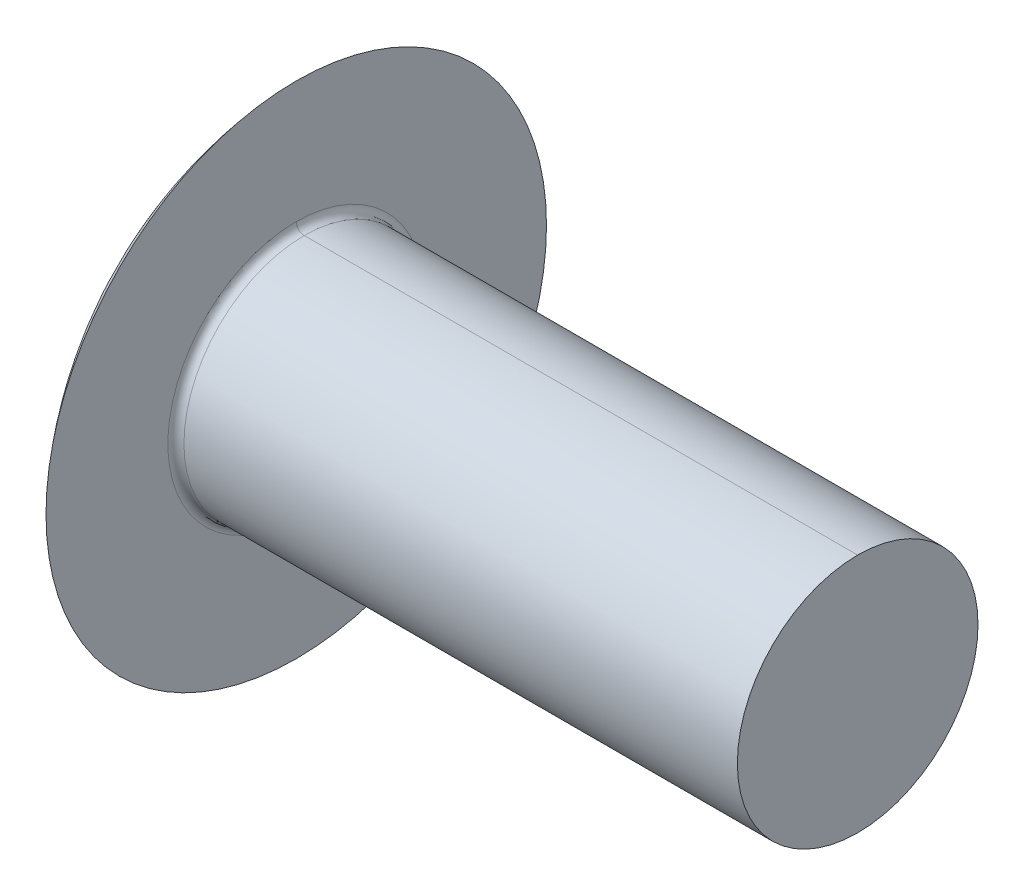
ISO-10303-21;
HEADER;
FILE_DESCRIPTION(('STEP AP214'),'2;1');
FILE_NAME('part.step','',(''),(''),'','','');
FILE_SCHEMA(('AUTOMOTIVE_DESIGN { 1 0 10303 214 1 1 1 1 }'));
ENDSEC;
DATA;
#1=APPLICATION_CONTEXT('core data for automotive mechanical design processes');
#2=APPLICATION_PROTOCOL_DEFINITION('international standard','automotive_design',2000,#1);
#3=PRODUCT_CONTEXT('',#1,'mechanical');
#4=PRODUCT('Part','Part','',(#3));
#5=PRODUCT_RELATED_PRODUCT_CATEGORY('part','',(#4));
#6=PRODUCT_DEFINITION_FORMATION('','',#4);
#7=PRODUCT_DEFINITION_CONTEXT('part definition',#1,'design');
#8=PRODUCT_DEFINITION('design','',#6,#7);
#9=PRODUCT_DEFINITION_SHAPE('','',#8);
#10=(LENGTH_UNIT() NAMED_UNIT(*) SI_UNIT(.MILLI.,.METRE.));
#11=(NAMED_UNIT(*) PLANE_ANGLE_UNIT() SI_UNIT($,.RADIAN.));
#12=(NAMED_UNIT(*) SI_UNIT($,.STERADIAN.) SOLID_ANGLE_UNIT());
#13=UNCERTAINTY_MEASURE_WITH_UNIT(LENGTH_MEASURE(1.E-05),#10,'distance_accuracy_value','');
#14=(GEOMETRIC_REPRESENTATION_CONTEXT(3) GLOBAL_UNCERTAINTY_ASSIGNED_CONTEXT((#13)) GLOBAL_UNIT_ASSIGNED_CONTEXT((#10,
#11,#12)) REPRESENTATION_CONTEXT('',''));
#15=CARTESIAN_POINT('',(0.,0.,0.));
#16=DIRECTION('',(0.,0.,1.));
#17=DIRECTION('',(1.,0.,0.));
#18=AXIS2_PLACEMENT_3D('',#15,#16,#17);
#19=CARTESIAN_POINT('',(0.,0.,0.));
#20=DIRECTION('',(-1.,0.,0.));
#21=DIRECTION('',(0.,-1.,0.));
#22=AXIS2_PLACEMENT_3D('',#19,#20,#21);
#23=CYLINDRICAL_SURFACE('',#22,1.5);
#24=DIRECTION('',(-1.,0.,0.));
#25=VECTOR('',#24,1.);
#26=CARTESIAN_POINT('',(0.,1.5,0.));
#27=LINE('',#26,#25);
#28=CARTESIAN_POINT('',(8.2,1.5,0.));
#29=VERTEX_POINT('',#28);
#30=CARTESIAN_POINT('',(1.3,1.5,0.));
#31=VERTEX_POINT('',#30);
#32=EDGE_CURVE('E85',#29,#31,#27,.T.);
#33=ORIENTED_EDGE('',*,*,#32,.F.);
#34=CARTESIAN_POINT('',(8.2,0.,0.));
#35=DIRECTION('',(-1.,0.,0.));
#36=DIRECTION('',(0.,-1.,0.));
#37=AXIS2_PLACEMENT_3D('',#34,#35,#36);
#38=CIRCLE('',#37,1.5);
#39=CARTESIAN_POINT('',(8.2,-1.5,0.));
#40=VERTEX_POINT('',#39);
#41=EDGE_CURVE('E10',#29,#40,#38,.T.);
#42=ORIENTED_EDGE('',*,*,#41,.T.);
#43=DIRECTION('',(-1.,0.,0.));
#44=VECTOR('',#43,1.);
#45=CARTESIAN_POINT('',(0.,-1.5,0.));
#46=LINE('',#45,#44);
#47=CARTESIAN_POINT('',(1.3,-1.5,0.));
#48=VERTEX_POINT('',#47);
#49=EDGE_CURVE('E82',#40,#48,#46,.T.);
#50=ORIENTED_EDGE('',*,*,#49,.T.);
#51=CARTESIAN_POINT('',(1.3,0.,0.));
#52=DIRECTION('',(-1.,0.,0.));
#53=DIRECTION('',(0.,-1.,0.));
#54=AXIS2_PLACEMENT_3D('',#51,#52,#53);
#55=CIRCLE('',#54,1.5);
#56=EDGE_CURVE('E67',#31,#48,#55,.T.);
#57=ORIENTED_EDGE('',*,*,#56,.F.);
#58=EDGE_LOOP('',(#33,#42,#50,#57));
#59=FACE_BOUND('',#58,.T.);
#60=ADVANCED_FACE('F15',(#59),#23,.T.);
#61=CARTESIAN_POINT('',(8.2,1.5,0.));
#62=DIRECTION('',(-1.,0.,0.));
#63=DIRECTION('',(0.,0.,1.));
#64=AXIS2_PLACEMENT_3D('',#61,#62,#63);
#65=PLANE('',#64);
#66=CARTESIAN_POINT('',(8.2,0.,0.));
#67=DIRECTION('',(-1.,0.,0.));
#68=DIRECTION('',(0.,-1.,0.));
#69=AXIS2_PLACEMENT_3D('',#66,#67,#68);
#70=CIRCLE('',#69,1.5);
#71=EDGE_CURVE('E91',#40,#29,#70,.T.);
#72=ORIENTED_EDGE('',*,*,#71,.F.);
#73=ORIENTED_EDGE('',*,*,#41,.F.);
#74=EDGE_LOOP('',(#72,#73));
#75=FACE_BOUND('',#74,.T.);
#76=ADVANCED_FACE('F17',(#75),#65,.F.);
#77=CARTESIAN_POINT('',(4.99826676265366,-0.1316410625591,0.));
#78=DIRECTION('',(0.,0.,1.));
#79=DIRECTION('',(0.,1.,0.));
#80=AXIS2_PLACEMENT_3D('',#77,#78,#79);
#81=CIRCLE('',#80,5.);
#82=TRIMMED_CURVE('',#81,(PARAMETER_VALUE(-1.54446507165844)),
(PARAMETER_VALUE(1.54446507165844)),.T.,.PARAMETER.);
#83=CARTESIAN_POINT('',(4.99826676265366,0.,0.));
#84=DIRECTION('',(-1.,0.,0.));
#85=AXIS1_PLACEMENT('',#83,#84);
#86=SURFACE_OF_REVOLUTION('',#82,#85);
#87=CARTESIAN_POINT('',(4.99826676265366,-0.1316410625591,0.));
#88=DIRECTION('',(0.,0.,1.));
#89=DIRECTION('',(0.,-1.,0.));
#90=AXIS2_PLACEMENT_3D('',#87,#88,#89);
#91=CIRCLE('',#90,5.);
#92=CARTESIAN_POINT('',(1.2,3.12,0.));
#93=VERTEX_POINT('',#92);
#94=CARTESIAN_POINT('',(0.,0.,0.));
#95=VERTEX_POINT('',#94);
#96=EDGE_CURVE('E19',#93,#95,#91,.T.);
#97=ORIENTED_EDGE('',*,*,#96,.F.);
#98=CARTESIAN_POINT('',(1.2,0.,0.));
#99=DIRECTION('',(-1.,0.,0.));
#100=DIRECTION('',(0.,-1.,0.));
#101=AXIS2_PLACEMENT_3D('',#98,#99,#100);
#102=CIRCLE('',#101,3.12);
#103=CARTESIAN_POINT('',(1.2,-3.12,0.));
#104=VERTEX_POINT('',#103);
#105=EDGE_CURVE('E26',#93,#104,#102,.T.);
#106=ORIENTED_EDGE('',*,*,#105,.T.);
#107=CARTESIAN_POINT('',(4.99826676265366,0.1316410625591,0.));
#108=DIRECTION('',(0.,0.,-1.));
#109=DIRECTION('',(-1.,0.,0.));
#110=AXIS2_PLACEMENT_3D('',#107,#108,#109);
#111=CIRCLE('',#110,5.);
#112=EDGE_CURVE('E123',#104,#95,#111,.T.);
#113=ORIENTED_EDGE('',*,*,#112,.T.);
#114=EDGE_LOOP('',(#97,#106,#113));
#115=FACE_BOUND('',#114,.T.);
#116=ADVANCED_FACE('F135',(#115),#86,.T.);
#117=CARTESIAN_POINT('',(1.2,3.12,0.));
#118=DIRECTION('',(-1.,0.,0.));
#119=DIRECTION('',(0.,0.,1.));
#120=AXIS2_PLACEMENT_3D('',#117,#118,#119);
#121=PLANE('',#120);
#122=CARTESIAN_POINT('',(1.2,0.,0.));
#123=DIRECTION('',(-1.,0.,0.));
#124=DIRECTION('',(0.,-1.,0.));
#125=AXIS2_PLACEMENT_3D('',#122,#123,#124);
#126=CIRCLE('',#125,1.6);
#127=CARTESIAN_POINT('',(1.2,-1.6,0.));
#128=VERTEX_POINT('',#127);
#129=CARTESIAN_POINT('',(1.2,1.6,0.));
#130=VERTEX_POINT('',#129);
#131=EDGE_CURVE('E41',#128,#130,#126,.T.);
#132=ORIENTED_EDGE('',*,*,#131,.T.);
#133=CARTESIAN_POINT('',(1.2,0.,0.));
#134=DIRECTION('',(-1.,0.,0.));
#135=DIRECTION('',(0.,-1.,0.));
#136=AXIS2_PLACEMENT_3D('',#133,#134,#135);
#137=CIRCLE('',#136,1.6);
#138=EDGE_CURVE('E120',#130,#128,#137,.T.);
#139=ORIENTED_EDGE('',*,*,#138,.T.);
#140=EDGE_LOOP('',(#132,#139));
#141=FACE_BOUND('',#140,.T.);
#142=CARTESIAN_POINT('',(1.2,0.,0.));
#143=DIRECTION('',(-1.,0.,0.));
#144=DIRECTION('',(0.,-1.,0.));
#145=AXIS2_PLACEMENT_3D('',#142,#143,#144);
#146=CIRCLE('',#145,3.12);
#147=EDGE_CURVE('E94',#104,#93,#146,.T.);
#148=ORIENTED_EDGE('',*,*,#147,.F.);
#149=ORIENTED_EDGE('',*,*,#105,.F.);
#150=EDGE_LOOP('',(#148,#149));
#151=FACE_BOUND('',#150,.T.);
#152=ADVANCED_FACE('F131',(#141,#151),#121,.F.);
#153=CARTESIAN_POINT('',(1.3,0.,0.));
#154=DIRECTION('',(-1.,0.,0.));
#155=DIRECTION('',(0.,-1.,0.));
#156=AXIS2_PLACEMENT_3D('',#153,#154,#155);
#157=TOROIDAL_SURFACE('',#156,1.6,0.1);
#158=CARTESIAN_POINT('',(1.3,1.6,0.));
#159=DIRECTION('',(0.,0.,1.));
#160=DIRECTION('',(0.,-1.,0.));
#161=AXIS2_PLACEMENT_3D('',#158,#159,#160);
#162=CIRCLE('',#161,0.1);
#163=EDGE_CURVE('E122',#130,#31,#162,.T.);
#164=ORIENTED_EDGE('',*,*,#163,.F.);
#165=ORIENTED_EDGE('',*,*,#131,.F.);
#166=CARTESIAN_POINT('',(1.3,-1.6,0.));
#167=DIRECTION('',(0.,0.,-1.));
#168=DIRECTION('',(-1.,0.,0.));
#169=AXIS2_PLACEMENT_3D('',#166,#167,#168);
#170=CIRCLE('',#169,0.1);
#171=EDGE_CURVE('E55',#128,#48,#170,.T.);
#172=ORIENTED_EDGE('',*,*,#171,.T.);
#173=CARTESIAN_POINT('',(1.3,0.,0.));
#174=DIRECTION('',(-1.,0.,0.));
#175=DIRECTION('',(0.,-1.,0.));
#176=AXIS2_PLACEMENT_3D('',#173,#174,#175);
#177=CIRCLE('',#176,1.5);
#178=EDGE_CURVE('E92',#48,#31,#177,.T.);
#179=ORIENTED_EDGE('',*,*,#178,.T.);
#180=EDGE_LOOP('',(#164,#165,#172,#179));
#181=FACE_BOUND('',#180,.T.);
#182=ADVANCED_FACE('F134',(#181),#157,.F.);
#183=CARTESIAN_POINT('',(1.3,0.,0.));
#184=DIRECTION('',(-1.,0.,0.));
#185=DIRECTION('',(0.,-1.,0.));
#186=AXIS2_PLACEMENT_3D('',#183,#184,#185);
#187=TOROIDAL_SURFACE('',#186,1.6,0.1);
#188=ORIENTED_EDGE('',*,*,#138,.F.);
#189=ORIENTED_EDGE('',*,*,#163,.T.);
#190=ORIENTED_EDGE('',*,*,#56,.T.);
#191=ORIENTED_EDGE('',*,*,#171,.F.);
#192=EDGE_LOOP('',(#188,#189,#190,#191));
#193=FACE_BOUND('',#192,.T.);
#194=ADVANCED_FACE('F130',(#193),#187,.F.);
#195=CARTESIAN_POINT('',(4.99826676265366,-0.1316410625591,0.));
#196=DIRECTION('',(0.,0.,1.));
#197=DIRECTION('',(0.,1.,0.));
#198=AXIS2_PLACEMENT_3D('',#195,#196,#197);
#199=CIRCLE('',#198,5.);
#200=TRIMMED_CURVE('',#199,(PARAMETER_VALUE(-1.54446507165844)),
(PARAMETER_VALUE(1.54446507165844)),.T.,.PARAMETER.);
#201=CARTESIAN_POINT('',(4.99826676265366,0.,0.));
#202=DIRECTION('',(-1.,0.,0.));
#203=AXIS1_PLACEMENT('',#201,#202);
#204=SURFACE_OF_REVOLUTION('',#200,#203);
#205=ORIENTED_EDGE('',*,*,#147,.T.);
#206=ORIENTED_EDGE('',*,*,#96,.T.);
#207=ORIENTED_EDGE('',*,*,#112,.F.);
#208=EDGE_LOOP('',(#205,#206,#207));
#209=FACE_BOUND('',#208,.T.);
#210=ADVANCED_FACE('F147',(#209),#204,.T.);
#211=CARTESIAN_POINT('',(0.,0.,0.));
#212=DIRECTION('',(-1.,0.,0.));
#213=DIRECTION('',(0.,-1.,0.));
#214=AXIS2_PLACEMENT_3D('',#211,#212,#213);
#215=CYLINDRICAL_SURFACE('',#214,1.5);
#216=ORIENTED_EDGE('',*,*,#71,.T.);
#217=ORIENTED_EDGE('',*,*,#32,.T.);
#218=ORIENTED_EDGE('',*,*,#178,.F.);
#219=ORIENTED_EDGE('',*,*,#49,.F.);
#220=EDGE_LOOP('',(#216,#217,#218,#219));
#221=FACE_BOUND('',#220,.T.);
#222=ADVANCED_FACE('F90',(#221),#215,.T.);
#223=CLOSED_SHELL('',(#60,#76,#116,#152,#182,#194,#210,#222));
#224=MANIFOLD_SOLID_BREP('B1',#223);
#225=ADVANCED_BREP_SHAPE_REPRESENTATION('',(#18,#224),#14);
#226=SHAPE_DEFINITION_REPRESENTATION(#9,#225);
ENDSEC;
END-ISO-10303-21;
